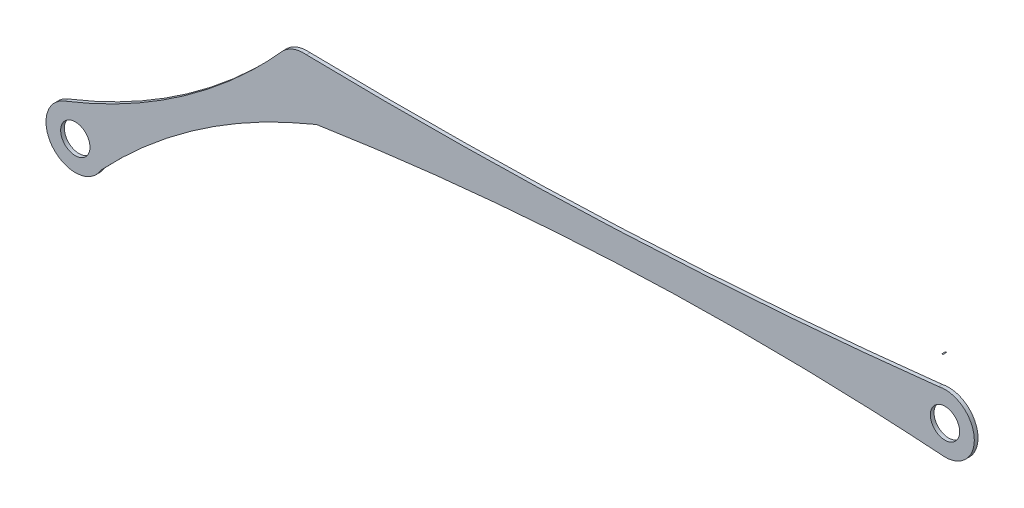
ISO-10303-21;
HEADER;
FILE_DESCRIPTION(('STEP AP214'),'2;1');
FILE_NAME('part.step','',(''),(''),'','','');
FILE_SCHEMA(('AUTOMOTIVE_DESIGN { 1 0 10303 214 1 1 1 1 }'));
ENDSEC;
DATA;
#1=APPLICATION_CONTEXT('core data for automotive mechanical design processes');
#2=APPLICATION_PROTOCOL_DEFINITION('international standard','automotive_design',2000,#1);
#3=PRODUCT_CONTEXT('',#1,'mechanical');
#4=PRODUCT('Part','Part','',(#3));
#5=PRODUCT_RELATED_PRODUCT_CATEGORY('part','',(#4));
#6=PRODUCT_DEFINITION_FORMATION('','',#4);
#7=PRODUCT_DEFINITION_CONTEXT('part definition',#1,'design');
#8=PRODUCT_DEFINITION('design','',#6,#7);
#9=PRODUCT_DEFINITION_SHAPE('','',#8);
#10=(LENGTH_UNIT() NAMED_UNIT(*) SI_UNIT(.MILLI.,.METRE.));
#11=(NAMED_UNIT(*) PLANE_ANGLE_UNIT() SI_UNIT($,.RADIAN.));
#12=(NAMED_UNIT(*) SI_UNIT($,.STERADIAN.) SOLID_ANGLE_UNIT());
#13=UNCERTAINTY_MEASURE_WITH_UNIT(LENGTH_MEASURE(1.E-05),#10,'distance_accuracy_value','');
#14=(GEOMETRIC_REPRESENTATION_CONTEXT(3) GLOBAL_UNCERTAINTY_ASSIGNED_CONTEXT((#13)) GLOBAL_UNIT_ASSIGNED_CONTEXT((#10,
#11,#12)) REPRESENTATION_CONTEXT('',''));
#15=CARTESIAN_POINT('',(0.,0.,0.));
#16=DIRECTION('',(0.,0.,1.));
#17=DIRECTION('',(1.,0.,0.));
#18=AXIS2_PLACEMENT_3D('',#15,#16,#17);
#19=CARTESIAN_POINT('',(-0.52906035135836,16.3616716902504,1.6002));
#20=DIRECTION('',(-0.0323184569402871,0.999477622231233,0.));
#21=DIRECTION('',(-0.999477622231233,-0.0323184569402871,0.));
#22=AXIS2_PLACEMENT_3D('',#19,#20,#21);
#23=PLANE('',#22);
#24=DIRECTION('',(0.,0.,-1.));
#25=VECTOR('',#24,1.);
#26=CARTESIAN_POINT('',(278.050297658474,25.3696322348745,1.6002));
#27=LINE('',#26,#25);
#28=CARTESIAN_POINT('',(278.050297658474,25.3696322348745,1.6002));
#29=VERTEX_POINT('',#28);
#30=CARTESIAN_POINT('',(278.050297658474,25.3696322348745,0.));
#31=VERTEX_POINT('',#30);
#32=EDGE_CURVE('E94',#29,#31,#27,.T.);
#33=ORIENTED_EDGE('',*,*,#32,.F.);
#34=DIRECTION('',(0.999477622231233,0.0323184569402871,0.));
#35=VECTOR('',#34,1.);
#36=CARTESIAN_POINT('',(-0.52906035135836,16.3616716902504,1.6002));
#37=LINE('',#36,#35);
#38=CARTESIAN_POINT('',(278.579111193717,25.3867316046733,1.6002));
#39=VERTEX_POINT('',#38);
#40=EDGE_CURVE('E108',#29,#39,#37,.T.);
#41=ORIENTED_EDGE('',*,*,#40,.T.);
#42=DIRECTION('',(0.,0.,-1.));
#43=VECTOR('',#42,1.);
#44=CARTESIAN_POINT('',(278.579111193717,25.3867316046733,1.6002));
#45=LINE('',#44,#43);
#46=CARTESIAN_POINT('',(278.579111193717,25.3867316046733,0.));
#47=VERTEX_POINT('',#46);
#48=EDGE_CURVE('E81',#39,#47,#45,.T.);
#49=ORIENTED_EDGE('',*,*,#48,.T.);
#50=DIRECTION('',(0.999477622231233,0.0323184569402871,0.));
#51=VECTOR('',#50,1.);
#52=CARTESIAN_POINT('',(-0.52906035135836,16.3616716902504,0.));
#53=LINE('',#52,#51);
#54=EDGE_CURVE('E101',#31,#47,#53,.T.);
#55=ORIENTED_EDGE('',*,*,#54,.F.);
#56=EDGE_LOOP('',(#33,#41,#49,#55));
#57=FACE_BOUND('',#56,.T.);
#58=ADVANCED_FACE('F57',(#57),#23,.T.);
#59=CARTESIAN_POINT('',(0.,0.,1.6002));
#60=DIRECTION('',(0.,0.,1.));
#61=DIRECTION('',(1.,0.,0.));
#62=AXIS2_PLACEMENT_3D('',#59,#60,#61);
#63=PLANE('',#62);
#64=DIRECTION('',(-0.999792334949234,-0.0203785911377483,0.));
#65=VECTOR('',#64,1.);
#66=CARTESIAN_POINT('',(-0.40141933284432,19.69399991223,1.6002));
#67=LINE('',#66,#65);
#68=CARTESIAN_POINT('',(278.240036284038,25.3734996438736,1.6002));
#69=VERTEX_POINT('',#68);
#70=EDGE_CURVE('E67',#69,#29,#67,.T.);
#71=ORIENTED_EDGE('',*,*,#70,.F.);
#72=CARTESIAN_POINT('',(279.4,0.,1.6002));
#73=DIRECTION('',(0.,0.,1.));
#74=DIRECTION('',(1.,0.,0.));
#75=AXIS2_PLACEMENT_3D('',#72,#73,#74);
#76=CIRCLE('',#75,25.4);
#77=EDGE_CURVE('E12',#39,#69,#76,.T.);
#78=ORIENTED_EDGE('',*,*,#77,.F.);
#79=ORIENTED_EDGE('',*,*,#40,.F.);
#80=EDGE_LOOP('',(#71,#78,#79));
#81=FACE_BOUND('',#80,.T.);
#82=ADVANCED_FACE('F112',(#81),#63,.T.);
#83=CARTESIAN_POINT('',(0.,0.,0.));
#84=DIRECTION('',(0.,0.,1.));
#85=DIRECTION('',(1.,0.,0.));
#86=AXIS2_PLACEMENT_3D('',#83,#84,#85);
#87=PLANE('',#86);
#88=CARTESIAN_POINT('',(279.4,0.,0.));
#89=DIRECTION('',(0.,0.,1.));
#90=DIRECTION('',(1.,0.,0.));
#91=AXIS2_PLACEMENT_3D('',#88,#89,#90);
#92=CIRCLE('',#91,25.4);
#93=CARTESIAN_POINT('',(278.240036284038,25.3734996438736,0.));
#94=VERTEX_POINT('',#93);
#95=EDGE_CURVE('E74',#47,#94,#92,.T.);
#96=ORIENTED_EDGE('',*,*,#95,.T.);
#97=DIRECTION('',(-0.999792334949234,-0.0203785911377483,0.));
#98=VECTOR('',#97,1.);
#99=CARTESIAN_POINT('',(-0.40141933284432,19.69399991223,0.));
#100=LINE('',#99,#98);
#101=EDGE_CURVE('E61',#94,#31,#100,.T.);
#102=ORIENTED_EDGE('',*,*,#101,.T.);
#103=ORIENTED_EDGE('',*,*,#54,.T.);
#104=EDGE_LOOP('',(#96,#102,#103));
#105=FACE_BOUND('',#104,.T.);
#106=ADVANCED_FACE('F59',(#105),#87,.F.);
#107=CARTESIAN_POINT('',(-0.40141933284432,19.69399991223,0.));
#108=DIRECTION('',(-0.0203785911377483,0.999792334949234,0.));
#109=DIRECTION('',(-0.999792334949234,-0.0203785911377483,0.));
#110=AXIS2_PLACEMENT_3D('',#107,#108,#109);
#111=PLANE('',#110);
#112=ORIENTED_EDGE('',*,*,#32,.T.);
#113=ORIENTED_EDGE('',*,*,#101,.F.);
#114=DIRECTION('',(0.,0.,1.));
#115=VECTOR('',#114,1.);
#116=CARTESIAN_POINT('',(278.240036284038,25.3734996438736,0.));
#117=LINE('',#116,#115);
#118=EDGE_CURVE('E100',#94,#69,#117,.T.);
#119=ORIENTED_EDGE('',*,*,#118,.T.);
#120=ORIENTED_EDGE('',*,*,#70,.T.);
#121=EDGE_LOOP('',(#112,#113,#119,#120));
#122=FACE_BOUND('',#121,.T.);
#123=ADVANCED_FACE('F95',(#122),#111,.F.);
#124=CARTESIAN_POINT('',(279.4,0.,0.));
#125=DIRECTION('',(0.,0.,1.));
#126=DIRECTION('',(1.,0.,0.));
#127=AXIS2_PLACEMENT_3D('',#124,#125,#126);
#128=CYLINDRICAL_SURFACE('',#127,25.4);
#129=ORIENTED_EDGE('',*,*,#48,.F.);
#130=ORIENTED_EDGE('',*,*,#77,.T.);
#131=ORIENTED_EDGE('',*,*,#118,.F.);
#132=ORIENTED_EDGE('',*,*,#95,.F.);
#133=EDGE_LOOP('',(#129,#130,#131,#132));
#134=FACE_BOUND('',#133,.T.);
#135=ADVANCED_FACE('F113',(#134),#128,.F.);
#136=CLOSED_SHELL('',(#58,#82,#106,#123,#135));
#137=MANIFOLD_SOLID_BREP('B2',#136);
#138=CARTESIAN_POINT('',(279.4,0.,1.6002));
#139=DIRECTION('',(0.,0.,-1.));
#140=DIRECTION('',(-1.,0.,0.));
#141=AXIS2_PLACEMENT_3D('',#138,#139,#140);
#142=CYLINDRICAL_SURFACE('',#141,6.35);
#143=CARTESIAN_POINT('',(279.4,0.,1.6002));
#144=DIRECTION('',(0.,0.,1.));
#145=DIRECTION('',(1.,0.,0.));
#146=AXIS2_PLACEMENT_3D('',#143,#144,#145);
#147=CIRCLE('',#146,6.35);
#148=CARTESIAN_POINT('',(285.75,0.,1.6002));
#149=VERTEX_POINT('',#148);
#150=EDGE_CURVE('E181',#149,#149,#147,.T.);
#151=ORIENTED_EDGE('',*,*,#150,.T.);
#152=EDGE_LOOP('',(#151));
#153=FACE_BOUND('',#152,.T.);
#154=CARTESIAN_POINT('',(279.4,0.,0.));
#155=DIRECTION('',(0.,0.,1.));
#156=DIRECTION('',(1.,0.,0.));
#157=AXIS2_PLACEMENT_3D('',#154,#155,#156);
#158=CIRCLE('',#157,6.35);
#159=CARTESIAN_POINT('',(285.75,0.,0.));
#160=VERTEX_POINT('',#159);
#161=EDGE_CURVE('E303',#160,#160,#158,.T.);
#162=ORIENTED_EDGE('',*,*,#161,.F.);
#163=EDGE_LOOP('',(#162));
#164=FACE_BOUND('',#163,.T.);
#165=ADVANCED_FACE('F172',(#153,#164),#142,.F.);
#166=CARTESIAN_POINT('',(0.,0.,1.6002));
#167=DIRECTION('',(0.,0.,1.));
#168=DIRECTION('',(1.,0.,0.));
#169=AXIS2_PLACEMENT_3D('',#166,#167,#168);
#170=PLANE('',#169);
#171=CARTESIAN_POINT('',(-97.2876442761107,-81.6340264301899,1.6002));
#172=DIRECTION('',(0.,0.,1.));
#173=DIRECTION('',(1.,0.,0.));
#174=AXIS2_PLACEMENT_3D('',#171,#172,#173);
#175=CIRCLE('',#174,6.34999999999999);
#176=CARTESIAN_POINT('',(-90.9376442761107,-81.6340264301899,1.6002));
#177=VERTEX_POINT('',#176);
#178=EDGE_CURVE('E55',#177,#177,#175,.T.);
#179=ORIENTED_EDGE('',*,*,#178,.F.);
#180=EDGE_LOOP('',(#179));
#181=FACE_BOUND('',#180,.T.);
#182=ORIENTED_EDGE('',*,*,#150,.F.);
#183=EDGE_LOOP('',(#182));
#184=FACE_BOUND('',#183,.T.);
#185=CARTESIAN_POINT('',(0.,0.,1.6002));
#186=CARTESIAN_POINT('',(140.154018574454,-3.04429110088875,1.6002));
#187=CARTESIAN_POINT('',(279.4,12.7,1.6002));
#188=B_SPLINE_CURVE_WITH_KNOTS('',2,(#185,#186,#187),.UNSPECIFIED.,.F.,.F.,(3,3),(0.,1.),.UNSPECIFIED.);
#189=CARTESIAN_POINT('',(2.82207253456276,-0.05939582189329,1.6002));
#190=VERTEX_POINT('',#189);
#191=CARTESIAN_POINT('',(276.581108414465,12.3832083980283,1.6002));
#192=VERTEX_POINT('',#191);
#193=EDGE_CURVE('E365',#190,#192,#188,.T.);
#194=ORIENTED_EDGE('',*,*,#193,.F.);
#195=CARTESIAN_POINT('',(1.59523676217265,-12.7,1.6002));
#196=DIRECTION('',(0.,0.,1.));
#197=DIRECTION('',(1.,0.,0.));
#198=AXIS2_PLACEMENT_3D('',#195,#196,#197);
#199=CIRCLE('',#198,12.7);
#200=CARTESIAN_POINT('',(-8.30439723758859,-4.74467180621873,1.6002));
#201=VERTEX_POINT('',#200);
#202=EDGE_CURVE('E189',#190,#201,#199,.T.);
#203=ORIENTED_EDGE('',*,*,#202,.T.);
#204=CARTESIAN_POINT('',(-102.152006015084,-69.9025310066554,1.6002));
#205=CARTESIAN_POINT('',(-47.7797935797776,-48.4603475404764,1.6002));
#206=CARTESIAN_POINT('',(-8.30439723758859,-4.74467180621873,1.6002));
#207=B_SPLINE_CURVE_WITH_KNOTS('',2,(#204,#205,#206),.UNSPECIFIED.,.F.,.F.,(3,3),(0.,1.),.UNSPECIFIED.);
#208=CARTESIAN_POINT('',(-101.759421239261,-69.7473443535203,1.6002));
#209=VERTEX_POINT('',#208);
#210=EDGE_CURVE('E259',#209,#201,#207,.T.);
#211=ORIENTED_EDGE('',*,*,#210,.F.);
#212=CARTESIAN_POINT('',(-97.2876442761107,-81.6340264301899,1.6002));
#213=DIRECTION('',(0.,0.,1.));
#214=DIRECTION('',(1.,0.,0.));
#215=AXIS2_PLACEMENT_3D('',#212,#213,#214);
#216=CIRCLE('',#215,12.6999999999992);
#217=CARTESIAN_POINT('',(-86.2072981623329,-87.8401467963181,1.6002));
#218=VERTEX_POINT('',#217);
#219=EDGE_CURVE('E263',#209,#218,#216,.T.);
#220=ORIENTED_EDGE('',*,*,#219,.T.);
#221=CARTESIAN_POINT('',(7.34387265256246,-24.024450776957,1.6002));
#222=CARTESIAN_POINT('',(-46.6542742516972,-45.7709857700551,1.6002));
#223=CARTESIAN_POINT('',(-86.2072981623323,-87.8401467963185,1.6002));
#224=B_SPLINE_CURVE_WITH_KNOTS('',2,(#221,#222,#223),.UNSPECIFIED.,.F.,.F.,(3,3),(0.,1.),.UNSPECIFIED.);
#225=CARTESIAN_POINT('',(5.39119621883878,-24.8194344671419,1.6002));
#226=VERTEX_POINT('',#225);
#227=EDGE_CURVE('E339',#226,#218,#224,.T.);
#228=ORIENTED_EDGE('',*,*,#227,.F.);
#229=CARTESIAN_POINT('',(1.59523676217265,-12.7,1.6002));
#230=DIRECTION('',(0.,0.,1.));
#231=DIRECTION('',(1.,0.,0.));
#232=AXIS2_PLACEMENT_3D('',#229,#230,#231);
#233=CIRCLE('',#232,12.7);
#234=CARTESIAN_POINT('',(7.34387265256245,-24.024450776957,1.6002));
#235=VERTEX_POINT('',#234);
#236=EDGE_CURVE('E345',#226,#235,#233,.T.);
#237=ORIENTED_EDGE('',*,*,#236,.T.);
#238=CARTESIAN_POINT('',(7.34387265256246,-24.024450776957,1.6002));
#239=CARTESIAN_POINT('',(142.797342039724,-3.26005737329725,1.6002));
#240=CARTESIAN_POINT('',(279.4,-12.7,1.6002));
#241=B_SPLINE_CURVE_WITH_KNOTS('',2,(#238,#239,#240),.UNSPECIFIED.,.F.,.F.,(3,3),(0.,1.),.UNSPECIFIED.);
#242=CARTESIAN_POINT('',(277.670553151412,-12.5816935902091,1.6002));
#243=VERTEX_POINT('',#242);
#244=EDGE_CURVE('E352',#235,#243,#241,.T.);
#245=ORIENTED_EDGE('',*,*,#244,.T.);
#246=CARTESIAN_POINT('',(279.4,0.,1.6002));
#247=DIRECTION('',(0.,0.,1.));
#248=DIRECTION('',(1.,0.,0.));
#249=AXIS2_PLACEMENT_3D('',#246,#247,#248);
#250=CIRCLE('',#249,12.7);
#251=EDGE_CURVE('E358',#243,#192,#250,.T.);
#252=ORIENTED_EDGE('',*,*,#251,.T.);
#253=EDGE_LOOP('',(#194,#203,#211,#220,#228,#237,#245,#252));
#254=FACE_BOUND('',#253,.T.);
#255=ADVANCED_FACE('F282',(#181,#184,#254),#170,.T.);
#256=CARTESIAN_POINT('',(-97.2876442761107,-81.6340264301899,1.6002));
#257=DIRECTION('',(0.,0.,-1.));
#258=DIRECTION('',(-1.,0.,0.));
#259=AXIS2_PLACEMENT_3D('',#256,#257,#258);
#260=CYLINDRICAL_SURFACE('',#259,6.34999999999999);
#261=ORIENTED_EDGE('',*,*,#178,.T.);
#262=EDGE_LOOP('',(#261));
#263=FACE_BOUND('',#262,.T.);
#264=CARTESIAN_POINT('',(-97.2876442761107,-81.6340264301899,0.));
#265=DIRECTION('',(0.,0.,1.));
#266=DIRECTION('',(1.,0.,0.));
#267=AXIS2_PLACEMENT_3D('',#264,#265,#266);
#268=CIRCLE('',#267,6.34999999999999);
#269=CARTESIAN_POINT('',(-90.9376442761107,-81.6340264301899,0.));
#270=VERTEX_POINT('',#269);
#271=EDGE_CURVE('E175',#270,#270,#268,.T.);
#272=ORIENTED_EDGE('',*,*,#271,.F.);
#273=EDGE_LOOP('',(#272));
#274=FACE_BOUND('',#273,.T.);
#275=ADVANCED_FACE('F285',(#263,#274),#260,.F.);
#276=CARTESIAN_POINT('',(0.,0.,0.));
#277=DIRECTION('',(0.,0.,1.));
#278=DIRECTION('',(1.,0.,0.));
#279=AXIS2_PLACEMENT_3D('',#276,#277,#278);
#280=PLANE('',#279);
#281=ORIENTED_EDGE('',*,*,#271,.T.);
#282=EDGE_LOOP('',(#281));
#283=FACE_BOUND('',#282,.T.);
#284=ORIENTED_EDGE('',*,*,#161,.T.);
#285=EDGE_LOOP('',(#284));
#286=FACE_BOUND('',#285,.T.);
#287=CARTESIAN_POINT('',(1.59523676217265,-12.7,0.));
#288=DIRECTION('',(0.,0.,1.));
#289=DIRECTION('',(1.,0.,0.));
#290=AXIS2_PLACEMENT_3D('',#287,#288,#289);
#291=CIRCLE('',#290,12.7);
#292=CARTESIAN_POINT('',(2.82207253457054,-0.0593958218934494,0.));
#293=VERTEX_POINT('',#292);
#294=CARTESIAN_POINT('',(-8.30439723758859,-4.74467180621873,0.));
#295=VERTEX_POINT('',#294);
#296=EDGE_CURVE('E240',#293,#295,#291,.T.);
#297=ORIENTED_EDGE('',*,*,#296,.F.);
#298=CARTESIAN_POINT('',(0.,0.,0.));
#299=CARTESIAN_POINT('',(140.154018574454,-3.04429110088875,0.));
#300=CARTESIAN_POINT('',(279.4,12.7,0.));
#301=B_SPLINE_CURVE_WITH_KNOTS('',2,(#298,#299,#300),.UNSPECIFIED.,.F.,.F.,(3,3),(0.,1.),.UNSPECIFIED.);
#302=CARTESIAN_POINT('',(276.581108414471,12.3832083980289,0.));
#303=VERTEX_POINT('',#302);
#304=EDGE_CURVE('E247',#293,#303,#301,.T.);
#305=ORIENTED_EDGE('',*,*,#304,.T.);
#306=CARTESIAN_POINT('',(279.4,0.,0.));
#307=DIRECTION('',(0.,0.,1.));
#308=DIRECTION('',(1.,0.,0.));
#309=AXIS2_PLACEMENT_3D('',#306,#307,#308);
#310=CIRCLE('',#309,12.7);
#311=CARTESIAN_POINT('',(277.670553151412,-12.5816935902091,0.));
#312=VERTEX_POINT('',#311);
#313=EDGE_CURVE('E252',#312,#303,#310,.T.);
#314=ORIENTED_EDGE('',*,*,#313,.F.);
#315=CARTESIAN_POINT('',(7.34387265256246,-24.024450776957,0.));
#316=CARTESIAN_POINT('',(142.797342039724,-3.26005737329725,0.));
#317=CARTESIAN_POINT('',(279.4,-12.7,0.));
#318=B_SPLINE_CURVE_WITH_KNOTS('',2,(#315,#316,#317),.UNSPECIFIED.,.F.,.F.,(3,3),(0.,1.),.UNSPECIFIED.);
#319=CARTESIAN_POINT('',(7.34387265256245,-24.024450776957,0.));
#320=VERTEX_POINT('',#319);
#321=EDGE_CURVE('E410',#320,#312,#318,.T.);
#322=ORIENTED_EDGE('',*,*,#321,.F.);
#323=CARTESIAN_POINT('',(1.59523676217265,-12.7,0.));
#324=DIRECTION('',(0.,0.,1.));
#325=DIRECTION('',(1.,0.,0.));
#326=AXIS2_PLACEMENT_3D('',#323,#324,#325);
#327=CIRCLE('',#326,12.7);
#328=CARTESIAN_POINT('',(5.39119621883878,-24.8194344671419,0.));
#329=VERTEX_POINT('',#328);
#330=EDGE_CURVE('E405',#329,#320,#327,.T.);
#331=ORIENTED_EDGE('',*,*,#330,.F.);
#332=CARTESIAN_POINT('',(7.34387265256246,-24.024450776957,0.));
#333=CARTESIAN_POINT('',(-46.6542742516972,-45.7709857700551,0.));
#334=CARTESIAN_POINT('',(-86.2072981623323,-87.8401467963185,0.));
#335=B_SPLINE_CURVE_WITH_KNOTS('',2,(#332,#333,#334),.UNSPECIFIED.,.F.,.F.,(3,3),(0.,1.),.UNSPECIFIED.);
#336=CARTESIAN_POINT('',(-86.2072981623329,-87.8401467963181,0.));
#337=VERTEX_POINT('',#336);
#338=EDGE_CURVE('E398',#329,#337,#335,.T.);
#339=ORIENTED_EDGE('',*,*,#338,.T.);
#340=CARTESIAN_POINT('',(-97.2876442761107,-81.6340264301899,0.));
#341=DIRECTION('',(0.,0.,1.));
#342=DIRECTION('',(1.,0.,0.));
#343=AXIS2_PLACEMENT_3D('',#340,#341,#342);
#344=CIRCLE('',#343,12.6999999999992);
#345=CARTESIAN_POINT('',(-101.759421239261,-69.7473443535203,0.));
#346=VERTEX_POINT('',#345);
#347=EDGE_CURVE('E380',#346,#337,#344,.T.);
#348=ORIENTED_EDGE('',*,*,#347,.F.);
#349=CARTESIAN_POINT('',(-102.152006015084,-69.9025310066554,0.));
#350=CARTESIAN_POINT('',(-47.7797935797776,-48.4603475404764,0.));
#351=CARTESIAN_POINT('',(-8.30439723758859,-4.74467180621873,0.));
#352=B_SPLINE_CURVE_WITH_KNOTS('',2,(#349,#350,#351),.UNSPECIFIED.,.F.,.F.,(3,3),(0.,1.),.UNSPECIFIED.);
#353=EDGE_CURVE('E244',#346,#295,#352,.T.);
#354=ORIENTED_EDGE('',*,*,#353,.T.);
#355=EDGE_LOOP('',(#297,#305,#314,#322,#331,#339,#348,#354));
#356=FACE_BOUND('',#355,.T.);
#357=ADVANCED_FACE('F255',(#283,#286,#356),#280,.F.);
#358=DIRECTION('',(0.,0.,1.));
#359=VECTOR('',#358,1.);
#360=SURFACE_OF_LINEAR_EXTRUSION('',#301,#359);
#361=ORIENTED_EDGE('',*,*,#193,.T.);
#362=DIRECTION('',(0.,0.,1.));
#363=VECTOR('',#362,1.);
#364=CARTESIAN_POINT('',(276.581108414465,12.3832083980283,0.));
#365=LINE('',#364,#363);
#366=EDGE_CURVE('E197',#303,#192,#365,.T.);
#367=ORIENTED_EDGE('',*,*,#366,.F.);
#368=ORIENTED_EDGE('',*,*,#304,.F.);
#369=DIRECTION('',(0.,0.,1.));
#370=VECTOR('',#369,1.);
#371=CARTESIAN_POINT('',(2.82207253457054,-0.0593958218934494,0.));
#372=LINE('',#371,#370);
#373=EDGE_CURVE('E237',#293,#190,#372,.T.);
#374=ORIENTED_EDGE('',*,*,#373,.T.);
#375=EDGE_LOOP('',(#361,#367,#368,#374));
#376=FACE_BOUND('',#375,.T.);
#377=ADVANCED_FACE('F248',(#376),#360,.F.);
#378=CARTESIAN_POINT('',(279.4,0.,0.));
#379=DIRECTION('',(0.,0.,1.));
#380=DIRECTION('',(1.,0.,0.));
#381=AXIS2_PLACEMENT_3D('',#378,#379,#380);
#382=CYLINDRICAL_SURFACE('',#381,12.7);
#383=ORIENTED_EDGE('',*,*,#251,.F.);
#384=DIRECTION('',(0.,0.,1.));
#385=VECTOR('',#384,1.);
#386=CARTESIAN_POINT('',(277.670553151412,-12.5816935902091,0.));
#387=LINE('',#386,#385);
#388=EDGE_CURVE('E317',#312,#243,#387,.T.);
#389=ORIENTED_EDGE('',*,*,#388,.F.);
#390=ORIENTED_EDGE('',*,*,#313,.T.);
#391=ORIENTED_EDGE('',*,*,#366,.T.);
#392=EDGE_LOOP('',(#383,#389,#390,#391));
#393=FACE_BOUND('',#392,.T.);
#394=ADVANCED_FACE('F277',(#393),#382,.T.);
#395=DIRECTION('',(0.,0.,1.));
#396=VECTOR('',#395,1.);
#397=SURFACE_OF_LINEAR_EXTRUSION('',#318,#396);
#398=ORIENTED_EDGE('',*,*,#244,.F.);
#399=DIRECTION('',(0.,0.,1.));
#400=VECTOR('',#399,1.);
#401=CARTESIAN_POINT('',(7.34387265256245,-24.024450776957,0.));
#402=LINE('',#401,#400);
#403=EDGE_CURVE('E320',#320,#235,#402,.T.);
#404=ORIENTED_EDGE('',*,*,#403,.F.);
#405=ORIENTED_EDGE('',*,*,#321,.T.);
#406=ORIENTED_EDGE('',*,*,#388,.T.);
#407=EDGE_LOOP('',(#398,#404,#405,#406));
#408=FACE_BOUND('',#407,.T.);
#409=ADVANCED_FACE('F418',(#408),#397,.T.);
#410=CARTESIAN_POINT('',(1.59523676217265,-12.7,0.));
#411=DIRECTION('',(0.,0.,1.));
#412=DIRECTION('',(1.,0.,0.));
#413=AXIS2_PLACEMENT_3D('',#410,#411,#412);
#414=CYLINDRICAL_SURFACE('',#413,12.7);
#415=ORIENTED_EDGE('',*,*,#236,.F.);
#416=DIRECTION('',(0.,0.,1.));
#417=VECTOR('',#416,1.);
#418=CARTESIAN_POINT('',(5.39119621883878,-24.8194344671419,0.));
#419=LINE('',#418,#417);
#420=EDGE_CURVE('E323',#329,#226,#419,.T.);
#421=ORIENTED_EDGE('',*,*,#420,.F.);
#422=ORIENTED_EDGE('',*,*,#330,.T.);
#423=ORIENTED_EDGE('',*,*,#403,.T.);
#424=EDGE_LOOP('',(#415,#421,#422,#423));
#425=FACE_BOUND('',#424,.T.);
#426=ADVANCED_FACE('F396',(#425),#414,.T.);
#427=DIRECTION('',(0.,0.,1.));
#428=VECTOR('',#427,1.);
#429=SURFACE_OF_LINEAR_EXTRUSION('',#335,#428);
#430=ORIENTED_EDGE('',*,*,#227,.T.);
#431=DIRECTION('',(0.,0.,1.));
#432=VECTOR('',#431,1.);
#433=CARTESIAN_POINT('',(-86.2072981623329,-87.8401467963181,0.));
#434=LINE('',#433,#432);
#435=EDGE_CURVE('E326',#337,#218,#434,.T.);
#436=ORIENTED_EDGE('',*,*,#435,.F.);
#437=ORIENTED_EDGE('',*,*,#338,.F.);
#438=ORIENTED_EDGE('',*,*,#420,.T.);
#439=EDGE_LOOP('',(#430,#436,#437,#438));
#440=FACE_BOUND('',#439,.T.);
#441=ADVANCED_FACE('F392',(#440),#429,.F.);
#442=CARTESIAN_POINT('',(-97.2876442761107,-81.6340264301899,0.));
#443=DIRECTION('',(0.,0.,1.));
#444=DIRECTION('',(1.,0.,0.));
#445=AXIS2_PLACEMENT_3D('',#442,#443,#444);
#446=CYLINDRICAL_SURFACE('',#445,12.6999999999992);
#447=ORIENTED_EDGE('',*,*,#219,.F.);
#448=DIRECTION('',(0.,0.,1.));
#449=VECTOR('',#448,1.);
#450=CARTESIAN_POINT('',(-101.759421239261,-69.7473443535203,0.));
#451=LINE('',#450,#449);
#452=EDGE_CURVE('E310',#346,#209,#451,.T.);
#453=ORIENTED_EDGE('',*,*,#452,.F.);
#454=ORIENTED_EDGE('',*,*,#347,.T.);
#455=ORIENTED_EDGE('',*,*,#435,.T.);
#456=EDGE_LOOP('',(#447,#453,#454,#455));
#457=FACE_BOUND('',#456,.T.);
#458=ADVANCED_FACE('F388',(#457),#446,.T.);
#459=DIRECTION('',(0.,0.,1.));
#460=VECTOR('',#459,1.);
#461=SURFACE_OF_LINEAR_EXTRUSION('',#352,#460);
#462=ORIENTED_EDGE('',*,*,#210,.T.);
#463=DIRECTION('',(0.,0.,1.));
#464=VECTOR('',#463,1.);
#465=CARTESIAN_POINT('',(-8.30439723758859,-4.74467180621873,0.));
#466=LINE('',#465,#464);
#467=EDGE_CURVE('E306',#295,#201,#466,.T.);
#468=ORIENTED_EDGE('',*,*,#467,.F.);
#469=ORIENTED_EDGE('',*,*,#353,.F.);
#470=ORIENTED_EDGE('',*,*,#452,.T.);
#471=EDGE_LOOP('',(#462,#468,#469,#470));
#472=FACE_BOUND('',#471,.T.);
#473=ADVANCED_FACE('F281',(#472),#461,.F.);
#474=CARTESIAN_POINT('',(1.59523676217265,-12.7,0.));
#475=DIRECTION('',(0.,0.,1.));
#476=DIRECTION('',(1.,0.,0.));
#477=AXIS2_PLACEMENT_3D('',#474,#475,#476);
#478=CYLINDRICAL_SURFACE('',#477,12.7);
#479=ORIENTED_EDGE('',*,*,#202,.F.);
#480=ORIENTED_EDGE('',*,*,#373,.F.);
#481=ORIENTED_EDGE('',*,*,#296,.T.);
#482=ORIENTED_EDGE('',*,*,#467,.T.);
#483=EDGE_LOOP('',(#479,#480,#481,#482));
#484=FACE_BOUND('',#483,.T.);
#485=ADVANCED_FACE('F238',(#484),#478,.T.);
#486=CLOSED_SHELL('',(#165,#255,#275,#357,#377,#394,#409,#426,#441,#458,#473,#485));
#487=MANIFOLD_SOLID_BREP('B6',#486);
#488=ADVANCED_BREP_SHAPE_REPRESENTATION('',(#18,#137,#487),#14);
#489=SHAPE_DEFINITION_REPRESENTATION(#9,#488);
ENDSEC;
END-ISO-10303-21;
